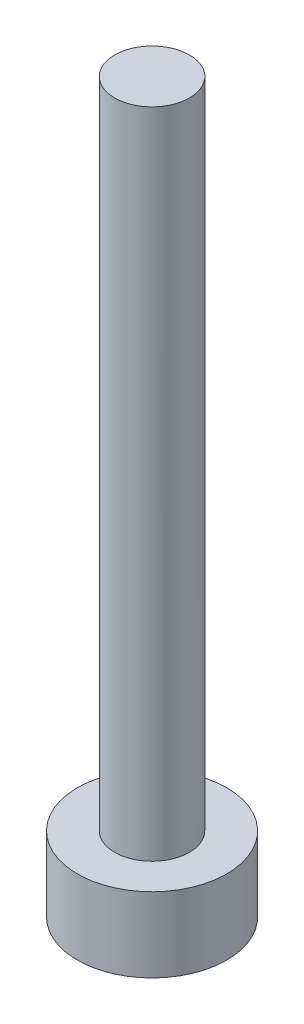
ISO-10303-21;
HEADER;
FILE_DESCRIPTION(('STEP AP214'),'2;1');
FILE_NAME('part.step','',(''),(''),'','','');
FILE_SCHEMA(('AUTOMOTIVE_DESIGN { 1 0 10303 214 1 1 1 1 }'));
ENDSEC;
DATA;
#1=APPLICATION_CONTEXT('core data for automotive mechanical design processes');
#2=APPLICATION_PROTOCOL_DEFINITION('international standard','automotive_design',2000,#1);
#3=PRODUCT_CONTEXT('',#1,'mechanical');
#4=PRODUCT('Part','Part','',(#3));
#5=PRODUCT_RELATED_PRODUCT_CATEGORY('part','',(#4));
#6=PRODUCT_DEFINITION_FORMATION('','',#4);
#7=PRODUCT_DEFINITION_CONTEXT('part definition',#1,'design');
#8=PRODUCT_DEFINITION('design','',#6,#7);
#9=PRODUCT_DEFINITION_SHAPE('','',#8);
#10=(LENGTH_UNIT() NAMED_UNIT(*) SI_UNIT(.MILLI.,.METRE.));
#11=(NAMED_UNIT(*) PLANE_ANGLE_UNIT() SI_UNIT($,.RADIAN.));
#12=(NAMED_UNIT(*) SI_UNIT($,.STERADIAN.) SOLID_ANGLE_UNIT());
#13=UNCERTAINTY_MEASURE_WITH_UNIT(LENGTH_MEASURE(1.E-05),#10,'distance_accuracy_value','');
#14=(GEOMETRIC_REPRESENTATION_CONTEXT(3) GLOBAL_UNCERTAINTY_ASSIGNED_CONTEXT((#13)) GLOBAL_UNIT_ASSIGNED_CONTEXT((#10,
#11,#12)) REPRESENTATION_CONTEXT('',''));
#15=CARTESIAN_POINT('',(0.,0.,0.));
#16=DIRECTION('',(0.,0.,1.));
#17=DIRECTION('',(1.,0.,0.));
#18=AXIS2_PLACEMENT_3D('',#15,#16,#17);
#19=CARTESIAN_POINT('',(0.,35.,0.));
#20=DIRECTION('',(0.,-1.,0.));
#21=DIRECTION('',(0.,0.,-1.));
#22=AXIS2_PLACEMENT_3D('',#19,#20,#21);
#23=CYLINDRICAL_SURFACE('',#22,2.);
#24=CARTESIAN_POINT('',(0.,35.,0.));
#25=DIRECTION('',(0.,1.,0.));
#26=DIRECTION('',(0.,0.,1.));
#27=AXIS2_PLACEMENT_3D('',#24,#25,#26);
#28=CIRCLE('',#27,2.);
#29=CARTESIAN_POINT('',(0.,35.,2.));
#30=VERTEX_POINT('',#29);
#31=EDGE_CURVE('E10',#30,#30,#28,.T.);
#32=ORIENTED_EDGE('',*,*,#31,.F.);
#33=EDGE_LOOP('',(#32));
#34=FACE_BOUND('',#33,.T.);
#35=CARTESIAN_POINT('',(0.,0.,0.));
#36=DIRECTION('',(0.,-1.,0.));
#37=DIRECTION('',(0.,0.,-1.));
#38=AXIS2_PLACEMENT_3D('',#35,#36,#37);
#39=CIRCLE('',#38,2.);
#40=CARTESIAN_POINT('',(0.,0.,-2.));
#41=VERTEX_POINT('',#40);
#42=EDGE_CURVE('E37',#41,#41,#39,.T.);
#43=ORIENTED_EDGE('',*,*,#42,.F.);
#44=EDGE_LOOP('',(#43));
#45=FACE_BOUND('',#44,.T.);
#46=ADVANCED_FACE('F31',(#34,#45),#23,.T.);
#47=CARTESIAN_POINT('',(0.,35.,0.));
#48=DIRECTION('',(0.,1.,0.));
#49=DIRECTION('',(0.,0.,1.));
#50=AXIS2_PLACEMENT_3D('',#47,#48,#49);
#51=PLANE('',#50);
#52=ORIENTED_EDGE('',*,*,#31,.T.);
#53=EDGE_LOOP('',(#52));
#54=FACE_BOUND('',#53,.T.);
#55=ADVANCED_FACE('F64',(#54),#51,.T.);
#56=CARTESIAN_POINT('',(0.,-4.,0.));
#57=DIRECTION('',(0.,1.,0.));
#58=DIRECTION('',(0.,0.,1.));
#59=AXIS2_PLACEMENT_3D('',#56,#57,#58);
#60=CYLINDRICAL_SURFACE('',#59,4.);
#61=CARTESIAN_POINT('',(0.,-4.,0.));
#62=DIRECTION('',(0.,-1.,0.));
#63=DIRECTION('',(0.,0.,-1.));
#64=AXIS2_PLACEMENT_3D('',#61,#62,#63);
#65=CIRCLE('',#64,4.);
#66=CARTESIAN_POINT('',(0.,-4.,-4.));
#67=VERTEX_POINT('',#66);
#68=EDGE_CURVE('E41',#67,#67,#65,.T.);
#69=ORIENTED_EDGE('',*,*,#68,.F.);
#70=EDGE_LOOP('',(#69));
#71=FACE_BOUND('',#70,.T.);
#72=CARTESIAN_POINT('',(0.,0.,0.));
#73=DIRECTION('',(0.,-1.,0.));
#74=DIRECTION('',(0.,0.,-1.));
#75=AXIS2_PLACEMENT_3D('',#72,#73,#74);
#76=CIRCLE('',#75,4.);
#77=CARTESIAN_POINT('',(0.,0.,-4.));
#78=VERTEX_POINT('',#77);
#79=EDGE_CURVE('E45',#78,#78,#76,.T.);
#80=ORIENTED_EDGE('',*,*,#79,.T.);
#81=EDGE_LOOP('',(#80));
#82=FACE_BOUND('',#81,.T.);
#83=ADVANCED_FACE('F51',(#71,#82),#60,.T.);
#84=CARTESIAN_POINT('',(0.,-4.,0.));
#85=DIRECTION('',(0.,-1.,0.));
#86=DIRECTION('',(0.,0.,-1.));
#87=AXIS2_PLACEMENT_3D('',#84,#85,#86);
#88=PLANE('',#87);
#89=ORIENTED_EDGE('',*,*,#68,.T.);
#90=EDGE_LOOP('',(#89));
#91=FACE_BOUND('',#90,.T.);
#92=ADVANCED_FACE('F55',(#91),#88,.T.);
#93=CARTESIAN_POINT('',(0.,0.,0.));
#94=DIRECTION('',(0.,-1.,0.));
#95=DIRECTION('',(0.,0.,-1.));
#96=AXIS2_PLACEMENT_3D('',#93,#94,#95);
#97=PLANE('',#96);
#98=ORIENTED_EDGE('',*,*,#42,.T.);
#99=EDGE_LOOP('',(#98));
#100=FACE_BOUND('',#99,.T.);
#101=ORIENTED_EDGE('',*,*,#79,.F.);
#102=EDGE_LOOP('',(#101));
#103=FACE_BOUND('',#102,.T.);
#104=ADVANCED_FACE('F53',(#100,#103),#97,.F.);
#105=CLOSED_SHELL('',(#46,#55,#83,#92,#104));
#106=MANIFOLD_SOLID_BREP('B2',#105);
#107=ADVANCED_BREP_SHAPE_REPRESENTATION('',(#18,#106),#14);
#108=SHAPE_DEFINITION_REPRESENTATION(#9,#107);
ENDSEC;
END-ISO-10303-21;
